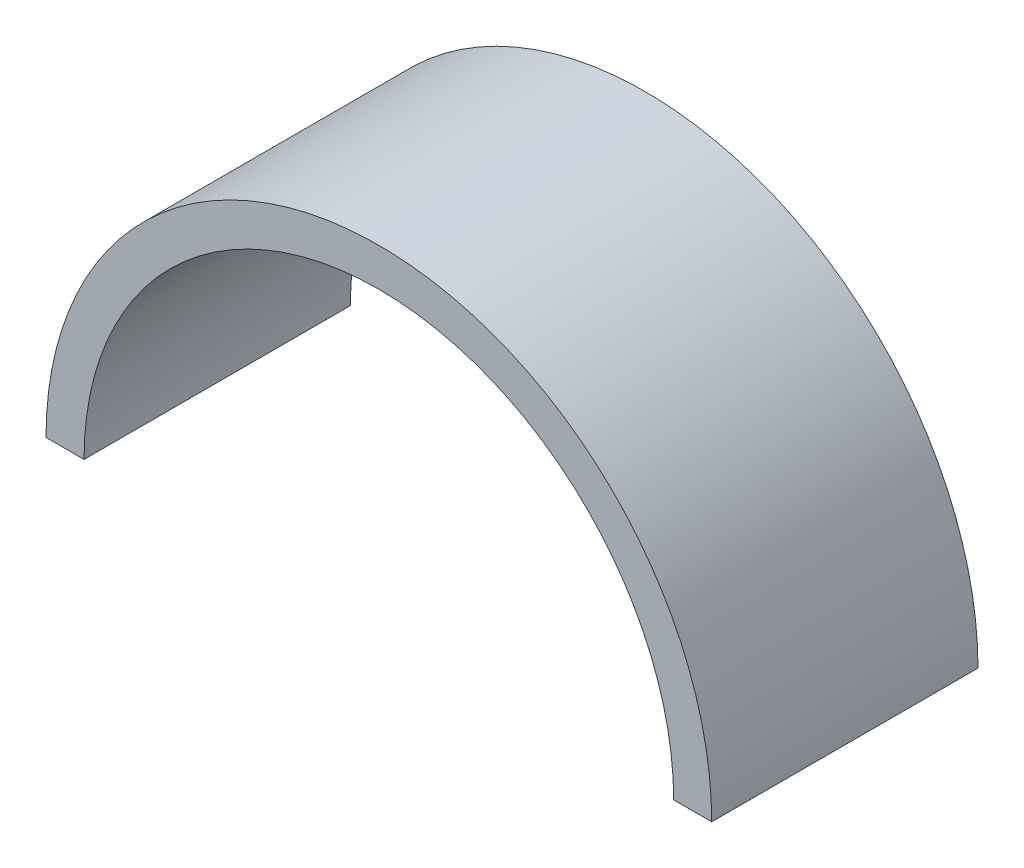
ISO-10303-21;
HEADER;
FILE_DESCRIPTION(('STEP AP214'),'2;1');
FILE_NAME('part.step','',(''),(''),'','','');
FILE_SCHEMA(('AUTOMOTIVE_DESIGN { 1 0 10303 214 1 1 1 1 }'));
ENDSEC;
DATA;
#1=APPLICATION_CONTEXT('core data for automotive mechanical design processes');
#2=APPLICATION_PROTOCOL_DEFINITION('international standard','automotive_design',2000,#1);
#3=PRODUCT_CONTEXT('',#1,'mechanical');
#4=PRODUCT('Part','Part','',(#3));
#5=PRODUCT_RELATED_PRODUCT_CATEGORY('part','',(#4));
#6=PRODUCT_DEFINITION_FORMATION('','',#4);
#7=PRODUCT_DEFINITION_CONTEXT('part definition',#1,'design');
#8=PRODUCT_DEFINITION('design','',#6,#7);
#9=PRODUCT_DEFINITION_SHAPE('','',#8);
#10=(LENGTH_UNIT() NAMED_UNIT(*) SI_UNIT(.MILLI.,.METRE.));
#11=(NAMED_UNIT(*) PLANE_ANGLE_UNIT() SI_UNIT($,.RADIAN.));
#12=(NAMED_UNIT(*) SI_UNIT($,.STERADIAN.) SOLID_ANGLE_UNIT());
#13=UNCERTAINTY_MEASURE_WITH_UNIT(LENGTH_MEASURE(1.E-05),#10,'distance_accuracy_value','');
#14=(GEOMETRIC_REPRESENTATION_CONTEXT(3) GLOBAL_UNCERTAINTY_ASSIGNED_CONTEXT((#13)) GLOBAL_UNIT_ASSIGNED_CONTEXT((#10,
#11,#12)) REPRESENTATION_CONTEXT('',''));
#15=CARTESIAN_POINT('',(0.,0.,0.));
#16=DIRECTION('',(0.,0.,1.));
#17=DIRECTION('',(1.,0.,0.));
#18=AXIS2_PLACEMENT_3D('',#15,#16,#17);
#19=CARTESIAN_POINT('',(0.,0.,14.));
#20=DIRECTION('',(0.,0.,-1.));
#21=DIRECTION('',(-1.,0.,0.));
#22=AXIS2_PLACEMENT_3D('',#19,#20,#21);
#23=CYLINDRICAL_SURFACE('',#22,17.5);
#24=CARTESIAN_POINT('',(0.,0.,0.));
#25=DIRECTION('',(0.,0.,1.));
#26=DIRECTION('',(1.,0.,0.));
#27=AXIS2_PLACEMENT_3D('',#24,#25,#26);
#28=CIRCLE('',#27,17.5);
#29=CARTESIAN_POINT('',(17.5,0.,0.));
#30=VERTEX_POINT('',#29);
#31=CARTESIAN_POINT('',(-17.5,0.,0.));
#32=VERTEX_POINT('',#31);
#33=EDGE_CURVE('E96',#30,#32,#28,.T.);
#34=ORIENTED_EDGE('',*,*,#33,.T.);
#35=DIRECTION('',(0.,0.,-1.));
#36=VECTOR('',#35,1.);
#37=CARTESIAN_POINT('',(-17.5,0.,14.));
#38=LINE('',#37,#36);
#39=CARTESIAN_POINT('',(-17.5,0.,14.));
#40=VERTEX_POINT('',#39);
#41=EDGE_CURVE('E11',#40,#32,#38,.T.);
#42=ORIENTED_EDGE('',*,*,#41,.F.);
#43=CARTESIAN_POINT('',(0.,0.,14.));
#44=DIRECTION('',(0.,0.,1.));
#45=DIRECTION('',(1.,0.,0.));
#46=AXIS2_PLACEMENT_3D('',#43,#44,#45);
#47=CIRCLE('',#46,17.5);
#48=CARTESIAN_POINT('',(17.5,0.,14.));
#49=VERTEX_POINT('',#48);
#50=EDGE_CURVE('E84',#49,#40,#47,.T.);
#51=ORIENTED_EDGE('',*,*,#50,.F.);
#52=DIRECTION('',(0.,0.,-1.));
#53=VECTOR('',#52,1.);
#54=CARTESIAN_POINT('',(17.5,0.,14.));
#55=LINE('',#54,#53);
#56=EDGE_CURVE('E92',#49,#30,#55,.T.);
#57=ORIENTED_EDGE('',*,*,#56,.T.);
#58=EDGE_LOOP('',(#34,#42,#51,#57));
#59=FACE_BOUND('',#58,.T.);
#60=ADVANCED_FACE('F33',(#59),#23,.T.);
#61=CARTESIAN_POINT('',(-17.5,0.,14.));
#62=DIRECTION('',(0.,1.,0.));
#63=DIRECTION('',(0.,0.,1.));
#64=AXIS2_PLACEMENT_3D('',#61,#62,#63);
#65=PLANE('',#64);
#66=DIRECTION('',(1.,0.,0.));
#67=VECTOR('',#66,1.);
#68=CARTESIAN_POINT('',(-17.5,0.,0.));
#69=LINE('',#68,#67);
#70=CARTESIAN_POINT('',(-15.5,0.,0.));
#71=VERTEX_POINT('',#70);
#72=EDGE_CURVE('E88',#32,#71,#69,.T.);
#73=ORIENTED_EDGE('',*,*,#72,.T.);
#74=DIRECTION('',(0.,0.,-1.));
#75=VECTOR('',#74,1.);
#76=CARTESIAN_POINT('',(-15.5,0.,14.));
#77=LINE('',#76,#75);
#78=CARTESIAN_POINT('',(-15.5,0.,14.));
#79=VERTEX_POINT('',#78);
#80=EDGE_CURVE('E41',#79,#71,#77,.T.);
#81=ORIENTED_EDGE('',*,*,#80,.F.);
#82=DIRECTION('',(1.,0.,0.));
#83=VECTOR('',#82,1.);
#84=CARTESIAN_POINT('',(-17.5,0.,14.));
#85=LINE('',#84,#83);
#86=EDGE_CURVE('E79',#40,#79,#85,.T.);
#87=ORIENTED_EDGE('',*,*,#86,.F.);
#88=ORIENTED_EDGE('',*,*,#41,.T.);
#89=EDGE_LOOP('',(#73,#81,#87,#88));
#90=FACE_BOUND('',#89,.T.);
#91=ADVANCED_FACE('F87',(#90),#65,.F.);
#92=CARTESIAN_POINT('',(0.,0.,14.));
#93=DIRECTION('',(0.,0.,-1.));
#94=DIRECTION('',(-1.,0.,0.));
#95=AXIS2_PLACEMENT_3D('',#92,#93,#94);
#96=CYLINDRICAL_SURFACE('',#95,15.5);
#97=CARTESIAN_POINT('',(0.,0.,0.));
#98=DIRECTION('',(0.,0.,-1.));
#99=DIRECTION('',(1.,0.,0.));
#100=AXIS2_PLACEMENT_3D('',#97,#98,#99);
#101=CIRCLE('',#100,15.5);
#102=CARTESIAN_POINT('',(15.5,0.,0.));
#103=VERTEX_POINT('',#102);
#104=EDGE_CURVE('E66',#71,#103,#101,.T.);
#105=ORIENTED_EDGE('',*,*,#104,.T.);
#106=DIRECTION('',(0.,0.,-1.));
#107=VECTOR('',#106,1.);
#108=CARTESIAN_POINT('',(15.5,0.,14.));
#109=LINE('',#108,#107);
#110=CARTESIAN_POINT('',(15.5,0.,14.));
#111=VERTEX_POINT('',#110);
#112=EDGE_CURVE('E89',#111,#103,#109,.T.);
#113=ORIENTED_EDGE('',*,*,#112,.F.);
#114=CARTESIAN_POINT('',(0.,0.,14.));
#115=DIRECTION('',(0.,0.,-1.));
#116=DIRECTION('',(1.,0.,0.));
#117=AXIS2_PLACEMENT_3D('',#114,#115,#116);
#118=CIRCLE('',#117,15.5);
#119=EDGE_CURVE('E82',#79,#111,#118,.T.);
#120=ORIENTED_EDGE('',*,*,#119,.F.);
#121=ORIENTED_EDGE('',*,*,#80,.T.);
#122=EDGE_LOOP('',(#105,#113,#120,#121));
#123=FACE_BOUND('',#122,.T.);
#124=ADVANCED_FACE('F90',(#123),#96,.F.);
#125=CARTESIAN_POINT('',(15.5,0.,14.));
#126=DIRECTION('',(0.,1.,0.));
#127=DIRECTION('',(0.,0.,1.));
#128=AXIS2_PLACEMENT_3D('',#125,#126,#127);
#129=PLANE('',#128);
#130=DIRECTION('',(1.,0.,0.));
#131=VECTOR('',#130,1.);
#132=CARTESIAN_POINT('',(15.5,0.,0.));
#133=LINE('',#132,#131);
#134=EDGE_CURVE('E72',#103,#30,#133,.T.);
#135=ORIENTED_EDGE('',*,*,#134,.T.);
#136=ORIENTED_EDGE('',*,*,#56,.F.);
#137=DIRECTION('',(1.,0.,0.));
#138=VECTOR('',#137,1.);
#139=CARTESIAN_POINT('',(15.5,0.,14.));
#140=LINE('',#139,#138);
#141=EDGE_CURVE('E49',#111,#49,#140,.T.);
#142=ORIENTED_EDGE('',*,*,#141,.F.);
#143=ORIENTED_EDGE('',*,*,#112,.T.);
#144=EDGE_LOOP('',(#135,#136,#142,#143));
#145=FACE_BOUND('',#144,.T.);
#146=ADVANCED_FACE('F103',(#145),#129,.F.);
#147=CARTESIAN_POINT('',(0.,0.,14.));
#148=DIRECTION('',(0.,0.,1.));
#149=DIRECTION('',(1.,0.,0.));
#150=AXIS2_PLACEMENT_3D('',#147,#148,#149);
#151=PLANE('',#150);
#152=ORIENTED_EDGE('',*,*,#50,.T.);
#153=ORIENTED_EDGE('',*,*,#86,.T.);
#154=ORIENTED_EDGE('',*,*,#119,.T.);
#155=ORIENTED_EDGE('',*,*,#141,.T.);
#156=EDGE_LOOP('',(#152,#153,#154,#155));
#157=FACE_BOUND('',#156,.T.);
#158=ADVANCED_FACE('F80',(#157),#151,.T.);
#159=CARTESIAN_POINT('',(0.,0.,0.));
#160=DIRECTION('',(0.,0.,1.));
#161=DIRECTION('',(1.,0.,0.));
#162=AXIS2_PLACEMENT_3D('',#159,#160,#161);
#163=PLANE('',#162);
#164=ORIENTED_EDGE('',*,*,#33,.F.);
#165=ORIENTED_EDGE('',*,*,#134,.F.);
#166=ORIENTED_EDGE('',*,*,#104,.F.);
#167=ORIENTED_EDGE('',*,*,#72,.F.);
#168=EDGE_LOOP('',(#164,#165,#166,#167));
#169=FACE_BOUND('',#168,.T.);
#170=ADVANCED_FACE('F106',(#169),#163,.F.);
#171=CLOSED_SHELL('',(#60,#91,#124,#146,#158,#170));
#172=MANIFOLD_SOLID_BREP('B2',#171);
#173=ADVANCED_BREP_SHAPE_REPRESENTATION('',(#18,#172),#14);
#174=SHAPE_DEFINITION_REPRESENTATION(#9,#173);
ENDSEC;
END-ISO-10303-21;
